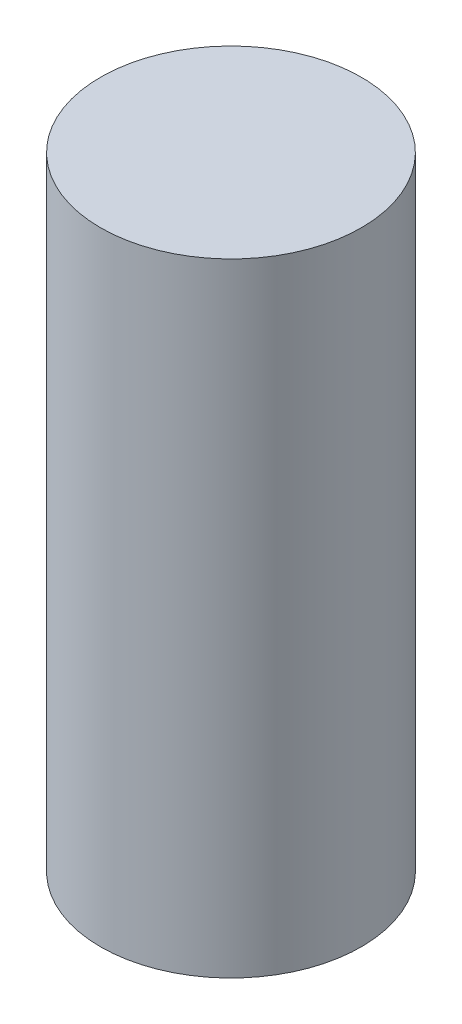
ISO-10303-21;
HEADER;
FILE_DESCRIPTION(('STEP AP214'),'2;1');
FILE_NAME('part.step','',(''),(''),'','','');
FILE_SCHEMA(('AUTOMOTIVE_DESIGN { 1 0 10303 214 1 1 1 1 }'));
ENDSEC;
DATA;
#1=APPLICATION_CONTEXT('core data for automotive mechanical design processes');
#2=APPLICATION_PROTOCOL_DEFINITION('international standard','automotive_design',2000,#1);
#3=PRODUCT_CONTEXT('',#1,'mechanical');
#4=PRODUCT('Part','Part','',(#3));
#5=PRODUCT_RELATED_PRODUCT_CATEGORY('part','',(#4));
#6=PRODUCT_DEFINITION_FORMATION('','',#4);
#7=PRODUCT_DEFINITION_CONTEXT('part definition',#1,'design');
#8=PRODUCT_DEFINITION('design','',#6,#7);
#9=PRODUCT_DEFINITION_SHAPE('','',#8);
#10=(LENGTH_UNIT() NAMED_UNIT(*) SI_UNIT(.MILLI.,.METRE.));
#11=(NAMED_UNIT(*) PLANE_ANGLE_UNIT() SI_UNIT($,.RADIAN.));
#12=(NAMED_UNIT(*) SI_UNIT($,.STERADIAN.) SOLID_ANGLE_UNIT());
#13=UNCERTAINTY_MEASURE_WITH_UNIT(LENGTH_MEASURE(1.E-05),#10,'distance_accuracy_value','');
#14=(GEOMETRIC_REPRESENTATION_CONTEXT(3) GLOBAL_UNCERTAINTY_ASSIGNED_CONTEXT((#13)) GLOBAL_UNIT_ASSIGNED_CONTEXT((#10,
#11,#12)) REPRESENTATION_CONTEXT('',''));
#15=CARTESIAN_POINT('',(0.,0.,0.));
#16=DIRECTION('',(0.,0.,1.));
#17=DIRECTION('',(1.,0.,0.));
#18=AXIS2_PLACEMENT_3D('',#15,#16,#17);
#19=CARTESIAN_POINT('',(44.999999999999,-18.4999999999999,1495.));
#20=DIRECTION('',(0.,1.,0.));
#21=DIRECTION('',(0.,0.,-1.));
#22=AXIS2_PLACEMENT_3D('',#19,#20,#21);
#23=CYLINDRICAL_SURFACE('',#22,2.5);
#24=CARTESIAN_POINT('',(44.999999999999,-18.4999999999999,1495.));
#25=DIRECTION('',(0.,-1.,0.));
#26=DIRECTION('',(0.,0.,1.));
#27=AXIS2_PLACEMENT_3D('',#24,#25,#26);
#28=CIRCLE('',#27,2.5);
#29=CARTESIAN_POINT('',(44.999999999999,-18.4999999999999,1497.5));
#30=VERTEX_POINT('',#29);
#31=EDGE_CURVE('E27',#30,#30,#28,.T.);
#32=ORIENTED_EDGE('',*,*,#31,.T.);
#33=EDGE_LOOP('',(#32));
#34=FACE_BOUND('',#33,.T.);
#35=CARTESIAN_POINT('',(44.999999999999,-2.49999999999995,1495.));
#36=DIRECTION('',(0.,1.,0.));
#37=DIRECTION('',(0.,0.,-1.));
#38=AXIS2_PLACEMENT_3D('',#35,#36,#37);
#39=CIRCLE('',#38,2.5);
#40=CARTESIAN_POINT('',(44.999999999999,-2.49999999999995,1492.5));
#41=VERTEX_POINT('',#40);
#42=EDGE_CURVE('E18',#41,#41,#39,.T.);
#43=ORIENTED_EDGE('',*,*,#42,.T.);
#44=EDGE_LOOP('',(#43));
#45=FACE_BOUND('',#44,.T.);
#46=ADVANCED_FACE('F14',(#34,#45),#23,.F.);
#47=CARTESIAN_POINT('',(44.999999999999,-18.4999999999999,1495.));
#48=DIRECTION('',(0.,-1.,0.));
#49=DIRECTION('',(0.,0.,1.));
#50=AXIS2_PLACEMENT_3D('',#47,#48,#49);
#51=PLANE('',#50);
#52=CARTESIAN_POINT('',(44.999999999999,-18.4999999999999,1495.));
#53=DIRECTION('',(0.,-1.,0.));
#54=DIRECTION('',(0.,0.,1.));
#55=AXIS2_PLACEMENT_3D('',#52,#53,#54);
#56=CIRCLE('',#55,3.56);
#57=CARTESIAN_POINT('',(44.999999999999,-18.4999999999999,1498.56));
#58=VERTEX_POINT('',#57);
#59=EDGE_CURVE('E10',#58,#58,#56,.T.);
#60=ORIENTED_EDGE('',*,*,#59,.T.);
#61=EDGE_LOOP('',(#60));
#62=FACE_BOUND('',#61,.T.);
#63=ORIENTED_EDGE('',*,*,#31,.F.);
#64=EDGE_LOOP('',(#63));
#65=FACE_BOUND('',#64,.T.);
#66=ADVANCED_FACE('F47',(#62,#65),#51,.T.);
#67=CARTESIAN_POINT('',(44.999999999999,-1.49999999999995,1495.));
#68=DIRECTION('',(0.,-1.,0.));
#69=DIRECTION('',(0.,0.,1.));
#70=AXIS2_PLACEMENT_3D('',#67,#68,#69);
#71=PLANE('',#70);
#72=CARTESIAN_POINT('',(44.999999999999,-1.49999999999995,1495.));
#73=DIRECTION('',(0.,-1.,0.));
#74=DIRECTION('',(0.,0.,1.));
#75=AXIS2_PLACEMENT_3D('',#72,#73,#74);
#76=CIRCLE('',#75,3.56);
#77=CARTESIAN_POINT('',(44.999999999999,-1.49999999999995,1498.56));
#78=VERTEX_POINT('',#77);
#79=EDGE_CURVE('E22',#78,#78,#76,.T.);
#80=ORIENTED_EDGE('',*,*,#79,.F.);
#81=EDGE_LOOP('',(#80));
#82=FACE_BOUND('',#81,.T.);
#83=ADVANCED_FACE('F43',(#82),#71,.F.);
#84=CARTESIAN_POINT('',(44.999999999999,-18.4999999999999,1495.));
#85=DIRECTION('',(0.,1.,0.));
#86=DIRECTION('',(0.,0.,-1.));
#87=AXIS2_PLACEMENT_3D('',#84,#85,#86);
#88=CYLINDRICAL_SURFACE('',#87,3.56);
#89=ORIENTED_EDGE('',*,*,#79,.T.);
#90=EDGE_LOOP('',(#89));
#91=FACE_BOUND('',#90,.T.);
#92=ORIENTED_EDGE('',*,*,#59,.F.);
#93=EDGE_LOOP('',(#92));
#94=FACE_BOUND('',#93,.T.);
#95=ADVANCED_FACE('F16',(#91,#94),#88,.T.);
#96=CARTESIAN_POINT('',(44.999999999999,-2.49999999999995,1495.));
#97=DIRECTION('',(0.,1.,0.));
#98=DIRECTION('',(0.,0.,-1.));
#99=AXIS2_PLACEMENT_3D('',#96,#97,#98);
#100=PLANE('',#99);
#101=ORIENTED_EDGE('',*,*,#42,.F.);
#102=EDGE_LOOP('',(#101));
#103=FACE_BOUND('',#102,.T.);
#104=ADVANCED_FACE('F36',(#103),#100,.F.);
#105=CLOSED_SHELL('',(#46,#66,#83,#95,#104));
#106=MANIFOLD_SOLID_BREP('B1',#105);
#107=ADVANCED_BREP_SHAPE_REPRESENTATION('',(#18,#106),#14);
#108=SHAPE_DEFINITION_REPRESENTATION(#9,#107);
ENDSEC;
END-ISO-10303-21;
